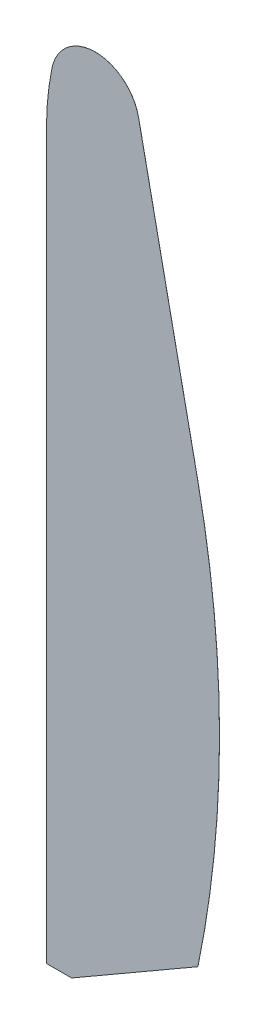
ISO-10303-21;
HEADER;
FILE_DESCRIPTION(('STEP AP214'),'2;1');
FILE_NAME('part.step','',(''),(''),'','','');
FILE_SCHEMA(('AUTOMOTIVE_DESIGN { 1 0 10303 214 1 1 1 1 }'));
ENDSEC;
DATA;
#1=APPLICATION_CONTEXT('core data for automotive mechanical design processes');
#2=APPLICATION_PROTOCOL_DEFINITION('international standard','automotive_design',2000,#1);
#3=PRODUCT_CONTEXT('',#1,'mechanical');
#4=PRODUCT('Part','Part','',(#3));
#5=PRODUCT_RELATED_PRODUCT_CATEGORY('part','',(#4));
#6=PRODUCT_DEFINITION_FORMATION('','',#4);
#7=PRODUCT_DEFINITION_CONTEXT('part definition',#1,'design');
#8=PRODUCT_DEFINITION('design','',#6,#7);
#9=PRODUCT_DEFINITION_SHAPE('','',#8);
#10=(LENGTH_UNIT() NAMED_UNIT(*) SI_UNIT(.MILLI.,.METRE.));
#11=(NAMED_UNIT(*) PLANE_ANGLE_UNIT() SI_UNIT($,.RADIAN.));
#12=(NAMED_UNIT(*) SI_UNIT($,.STERADIAN.) SOLID_ANGLE_UNIT());
#13=UNCERTAINTY_MEASURE_WITH_UNIT(LENGTH_MEASURE(1.E-05),#10,'distance_accuracy_value','');
#14=(GEOMETRIC_REPRESENTATION_CONTEXT(3) GLOBAL_UNCERTAINTY_ASSIGNED_CONTEXT((#13)) GLOBAL_UNIT_ASSIGNED_CONTEXT((#10,
#11,#12)) REPRESENTATION_CONTEXT('',''));
#15=CARTESIAN_POINT('',(0.,0.,0.));
#16=DIRECTION('',(0.,0.,1.));
#17=DIRECTION('',(1.,0.,0.));
#18=AXIS2_PLACEMENT_3D('',#15,#16,#17);
#19=CARTESIAN_POINT('',(9.72703932899535,153.209747665871,0.01));
#20=DIRECTION('',(0.,0.,-1.));
#21=DIRECTION('',(-1.,0.,0.));
#22=AXIS2_PLACEMENT_3D('',#19,#20,#21);
#23=CYLINDRICAL_SURFACE('',#22,8.79523950712746);
#24=CARTESIAN_POINT('',(9.72703932899535,153.209747665871,0.));
#25=DIRECTION('',(0.,0.,-1.));
#26=DIRECTION('',(-1.,0.,0.));
#27=AXIS2_PLACEMENT_3D('',#24,#25,#26);
#28=CIRCLE('',#27,8.79523950712746);
#29=CARTESIAN_POINT('',(1.11592821788536,155.,0.));
#30=VERTEX_POINT('',#29);
#31=CARTESIAN_POINT('',(18.3381504401054,155.,0.));
#32=VERTEX_POINT('',#31);
#33=EDGE_CURVE('E129',#30,#32,#28,.T.);
#34=ORIENTED_EDGE('',*,*,#33,.F.);
#35=DIRECTION('',(0.,0.,-1.));
#36=VECTOR('',#35,1.);
#37=CARTESIAN_POINT('',(1.11592821788536,155.,0.01));
#38=LINE('',#37,#36);
#39=CARTESIAN_POINT('',(1.11592821788536,155.,0.01));
#40=VERTEX_POINT('',#39);
#41=EDGE_CURVE('E11',#40,#30,#38,.T.);
#42=ORIENTED_EDGE('',*,*,#41,.F.);
#43=CARTESIAN_POINT('',(9.72703932899535,153.209747665871,0.01));
#44=DIRECTION('',(0.,0.,-1.));
#45=DIRECTION('',(-1.,0.,0.));
#46=AXIS2_PLACEMENT_3D('',#43,#44,#45);
#47=CIRCLE('',#46,8.79523950712746);
#48=CARTESIAN_POINT('',(18.3381504401054,155.,0.01));
#49=VERTEX_POINT('',#48);
#50=EDGE_CURVE('E144',#40,#49,#47,.T.);
#51=ORIENTED_EDGE('',*,*,#50,.T.);
#52=DIRECTION('',(0.,0.,-1.));
#53=VECTOR('',#52,1.);
#54=CARTESIAN_POINT('',(18.3381504401054,155.,0.01));
#55=LINE('',#54,#53);
#56=EDGE_CURVE('E42',#49,#32,#55,.T.);
#57=ORIENTED_EDGE('',*,*,#56,.T.);
#58=EDGE_LOOP('',(#34,#42,#51,#57));
#59=FACE_BOUND('',#58,.T.);
#60=ADVANCED_FACE('F41',(#59),#23,.T.);
#61=CARTESIAN_POINT('',(53.3044123630607,144.15,0.01));
#62=DIRECTION('',(0.,0.,-1.));
#63=DIRECTION('',(-1.,0.,0.));
#64=AXIS2_PLACEMENT_3D('',#61,#62,#63);
#65=CYLINDRICAL_SURFACE('',#64,53.3044123630607);
#66=CARTESIAN_POINT('',(53.3044123630607,144.15,0.));
#67=DIRECTION('',(0.,0.,-1.));
#68=DIRECTION('',(-1.,0.,0.));
#69=AXIS2_PLACEMENT_3D('',#66,#67,#68);
#70=CIRCLE('',#69,53.3044123630607);
#71=CARTESIAN_POINT('',(0.,144.15,0.));
#72=VERTEX_POINT('',#71);
#73=EDGE_CURVE('E141',#72,#30,#70,.T.);
#74=ORIENTED_EDGE('',*,*,#73,.F.);
#75=DIRECTION('',(0.,0.,-1.));
#76=VECTOR('',#75,1.);
#77=CARTESIAN_POINT('',(0.,144.15,0.01));
#78=LINE('',#77,#76);
#79=CARTESIAN_POINT('',(0.,144.15,0.01));
#80=VERTEX_POINT('',#79);
#81=EDGE_CURVE('E49',#80,#72,#78,.T.);
#82=ORIENTED_EDGE('',*,*,#81,.F.);
#83=CARTESIAN_POINT('',(53.3044123630607,144.15,0.01));
#84=DIRECTION('',(0.,0.,-1.));
#85=DIRECTION('',(-1.,0.,0.));
#86=AXIS2_PLACEMENT_3D('',#83,#84,#85);
#87=CIRCLE('',#86,53.3044123630607);
#88=EDGE_CURVE('E122',#80,#40,#87,.T.);
#89=ORIENTED_EDGE('',*,*,#88,.T.);
#90=ORIENTED_EDGE('',*,*,#41,.T.);
#91=EDGE_LOOP('',(#74,#82,#89,#90));
#92=FACE_BOUND('',#91,.T.);
#93=ADVANCED_FACE('F160',(#92),#65,.T.);
#94=CARTESIAN_POINT('',(0.,0.,0.01));
#95=DIRECTION('',(-1.,0.,0.));
#96=DIRECTION('',(0.,0.,1.));
#97=AXIS2_PLACEMENT_3D('',#94,#95,#96);
#98=PLANE('',#97);
#99=DIRECTION('',(0.,1.,0.));
#100=VECTOR('',#99,1.);
#101=CARTESIAN_POINT('',(0.,0.,0.));
#102=LINE('',#101,#100);
#103=CARTESIAN_POINT('',(0.,0.,0.));
#104=VERTEX_POINT('',#103);
#105=EDGE_CURVE('E109',#104,#72,#102,.T.);
#106=ORIENTED_EDGE('',*,*,#105,.F.);
#107=DIRECTION('',(0.,0.,-1.));
#108=VECTOR('',#107,1.);
#109=CARTESIAN_POINT('',(0.,0.,0.01));
#110=LINE('',#109,#108);
#111=CARTESIAN_POINT('',(0.,0.,0.01));
#112=VERTEX_POINT('',#111);
#113=EDGE_CURVE('E102',#112,#104,#110,.T.);
#114=ORIENTED_EDGE('',*,*,#113,.F.);
#115=DIRECTION('',(0.,1.,0.));
#116=VECTOR('',#115,1.);
#117=CARTESIAN_POINT('',(0.,0.,0.01));
#118=LINE('',#117,#116);
#119=EDGE_CURVE('E107',#112,#80,#118,.T.);
#120=ORIENTED_EDGE('',*,*,#119,.T.);
#121=ORIENTED_EDGE('',*,*,#81,.T.);
#122=EDGE_LOOP('',(#106,#114,#120,#121));
#123=FACE_BOUND('',#122,.T.);
#124=ADVANCED_FACE('F106',(#123),#98,.T.);
#125=CARTESIAN_POINT('',(0.,0.,0.01));
#126=DIRECTION('',(0.,1.,0.));
#127=DIRECTION('',(-1.,0.,0.));
#128=AXIS2_PLACEMENT_3D('',#125,#126,#127);
#129=PLANE('',#128);
#130=DIRECTION('',(1.,0.,0.));
#131=VECTOR('',#130,1.);
#132=CARTESIAN_POINT('',(0.,0.,0.));
#133=LINE('',#132,#131);
#134=CARTESIAN_POINT('',(5.,0.,0.));
#135=VERTEX_POINT('',#134);
#136=EDGE_CURVE('E139',#104,#135,#133,.T.);
#137=ORIENTED_EDGE('',*,*,#136,.T.);
#138=DIRECTION('',(0.,0.,-1.));
#139=VECTOR('',#138,1.);
#140=CARTESIAN_POINT('',(5.,0.,0.01));
#141=LINE('',#140,#139);
#142=CARTESIAN_POINT('',(5.,0.,0.01));
#143=VERTEX_POINT('',#142);
#144=EDGE_CURVE('E114',#143,#135,#141,.T.);
#145=ORIENTED_EDGE('',*,*,#144,.F.);
#146=DIRECTION('',(1.,0.,0.));
#147=VECTOR('',#146,1.);
#148=CARTESIAN_POINT('',(0.,0.,0.01));
#149=LINE('',#148,#147);
#150=EDGE_CURVE('E119',#112,#143,#149,.T.);
#151=ORIENTED_EDGE('',*,*,#150,.F.);
#152=ORIENTED_EDGE('',*,*,#113,.T.);
#153=EDGE_LOOP('',(#137,#145,#151,#152));
#154=FACE_BOUND('',#153,.T.);
#155=ADVANCED_FACE('F116',(#154),#129,.F.);
#156=CARTESIAN_POINT('',(5.,0.,0.01));
#157=DIRECTION('',(-0.500000000000001,0.866025403784438,0.));
#158=DIRECTION('',(-0.866025403784438,-0.500000000000001,0.));
#159=AXIS2_PLACEMENT_3D('',#156,#157,#158);
#160=PLANE('',#159);
#161=DIRECTION('',(0.866025403784438,0.500000000000001,0.));
#162=VECTOR('',#161,1.);
#163=CARTESIAN_POINT('',(5.,0.,0.));
#164=LINE('',#163,#162);
#165=CARTESIAN_POINT('',(30.138888888885,14.5139442671258,0.));
#166=VERTEX_POINT('',#165);
#167=EDGE_CURVE('E136',#135,#166,#164,.T.);
#168=ORIENTED_EDGE('',*,*,#167,.T.);
#169=DIRECTION('',(0.,0.,-1.));
#170=VECTOR('',#169,1.);
#171=CARTESIAN_POINT('',(30.138888888885,14.5139442671258,0.01));
#172=LINE('',#171,#170);
#173=CARTESIAN_POINT('',(30.138888888885,14.5139442671258,0.01));
#174=VERTEX_POINT('',#173);
#175=EDGE_CURVE('E149',#174,#166,#172,.T.);
#176=ORIENTED_EDGE('',*,*,#175,.F.);
#177=DIRECTION('',(0.866025403784438,0.500000000000001,0.));
#178=VECTOR('',#177,1.);
#179=CARTESIAN_POINT('',(5.,0.,0.01));
#180=LINE('',#179,#178);
#181=EDGE_CURVE('E123',#143,#174,#180,.T.);
#182=ORIENTED_EDGE('',*,*,#181,.F.);
#183=ORIENTED_EDGE('',*,*,#144,.T.);
#184=EDGE_LOOP('',(#168,#176,#182,#183));
#185=FACE_BOUND('',#184,.T.);
#186=ADVANCED_FACE('F168',(#185),#160,.F.);
#187=CARTESIAN_POINT('',(-171.218523036127,56.3762047863051,0.01));
#188=DIRECTION('',(0.,0.,-1.));
#189=DIRECTION('',(-1.,0.,0.));
#190=AXIS2_PLACEMENT_3D('',#187,#188,#189);
#191=CYLINDRICAL_SURFACE('',#190,205.662967480571);
#192=CARTESIAN_POINT('',(-171.218523036127,56.3762047863051,0.));
#193=DIRECTION('',(0.,0.,1.));
#194=DIRECTION('',(1.,0.,0.));
#195=AXIS2_PLACEMENT_3D('',#192,#193,#194);
#196=CIRCLE('',#195,205.662967480571);
#197=CARTESIAN_POINT('',(30.138888888885,98.2384653054842,0.));
#198=VERTEX_POINT('',#197);
#199=EDGE_CURVE('E132',#166,#198,#196,.T.);
#200=ORIENTED_EDGE('',*,*,#199,.T.);
#201=DIRECTION('',(0.,0.,-1.));
#202=VECTOR('',#201,1.);
#203=CARTESIAN_POINT('',(30.138888888885,98.2384653054842,0.01));
#204=LINE('',#203,#202);
#205=CARTESIAN_POINT('',(30.138888888885,98.2384653054842,0.01));
#206=VERTEX_POINT('',#205);
#207=EDGE_CURVE('E151',#206,#198,#204,.T.);
#208=ORIENTED_EDGE('',*,*,#207,.F.);
#209=CARTESIAN_POINT('',(-171.218523036127,56.3762047863051,0.01));
#210=DIRECTION('',(0.,0.,1.));
#211=DIRECTION('',(1.,0.,0.));
#212=AXIS2_PLACEMENT_3D('',#209,#210,#211);
#213=CIRCLE('',#212,205.662967480571);
#214=EDGE_CURVE('E234',#174,#206,#213,.T.);
#215=ORIENTED_EDGE('',*,*,#214,.F.);
#216=ORIENTED_EDGE('',*,*,#175,.T.);
#217=EDGE_LOOP('',(#200,#208,#215,#216));
#218=FACE_BOUND('',#217,.T.);
#219=ADVANCED_FACE('F175',(#218),#191,.T.);
#220=CARTESIAN_POINT('',(18.3381504401054,155.,0.01));
#221=DIRECTION('',(0.979064993526527,0.203547877539664,0.));
#222=DIRECTION('',(-0.203547877539664,0.979064993526527,0.));
#223=AXIS2_PLACEMENT_3D('',#220,#221,#222);
#224=PLANE('',#223);
#225=DIRECTION('',(0.203547877539664,-0.979064993526527,0.));
#226=VECTOR('',#225,1.);
#227=CARTESIAN_POINT('',(18.3381504401054,155.,0.));
#228=LINE('',#227,#226);
#229=EDGE_CURVE('E131',#32,#198,#228,.T.);
#230=ORIENTED_EDGE('',*,*,#229,.F.);
#231=ORIENTED_EDGE('',*,*,#56,.F.);
#232=DIRECTION('',(0.203547877539664,-0.979064993526527,0.));
#233=VECTOR('',#232,1.);
#234=CARTESIAN_POINT('',(18.3381504401054,155.,0.01));
#235=LINE('',#234,#233);
#236=EDGE_CURVE('E237',#49,#206,#235,.T.);
#237=ORIENTED_EDGE('',*,*,#236,.T.);
#238=ORIENTED_EDGE('',*,*,#207,.T.);
#239=EDGE_LOOP('',(#230,#231,#237,#238));
#240=FACE_BOUND('',#239,.T.);
#241=ADVANCED_FACE('F153',(#240),#224,.T.);
#242=CARTESIAN_POINT('',(9.72703932899535,153.209747665871,0.01));
#243=DIRECTION('',(0.,0.,-1.));
#244=DIRECTION('',(-1.,0.,0.));
#245=AXIS2_PLACEMENT_3D('',#242,#243,#244);
#246=PLANE('',#245);
#247=ORIENTED_EDGE('',*,*,#50,.F.);
#248=ORIENTED_EDGE('',*,*,#88,.F.);
#249=ORIENTED_EDGE('',*,*,#119,.F.);
#250=ORIENTED_EDGE('',*,*,#150,.T.);
#251=ORIENTED_EDGE('',*,*,#181,.T.);
#252=ORIENTED_EDGE('',*,*,#214,.T.);
#253=ORIENTED_EDGE('',*,*,#236,.F.);
#254=EDGE_LOOP('',(#247,#248,#249,#250,#251,#252,#253));
#255=FACE_BOUND('',#254,.T.);
#256=ADVANCED_FACE('F121',(#255),#246,.F.);
#257=CARTESIAN_POINT('',(9.72703932899535,153.209747665871,0.));
#258=DIRECTION('',(0.,0.,-1.));
#259=DIRECTION('',(-1.,0.,0.));
#260=AXIS2_PLACEMENT_3D('',#257,#258,#259);
#261=PLANE('',#260);
#262=ORIENTED_EDGE('',*,*,#33,.T.);
#263=ORIENTED_EDGE('',*,*,#229,.T.);
#264=ORIENTED_EDGE('',*,*,#199,.F.);
#265=ORIENTED_EDGE('',*,*,#167,.F.);
#266=ORIENTED_EDGE('',*,*,#136,.F.);
#267=ORIENTED_EDGE('',*,*,#105,.T.);
#268=ORIENTED_EDGE('',*,*,#73,.T.);
#269=EDGE_LOOP('',(#262,#263,#264,#265,#266,#267,#268));
#270=FACE_BOUND('',#269,.T.);
#271=ADVANCED_FACE('F156',(#270),#261,.T.);
#272=CLOSED_SHELL('',(#60,#93,#124,#155,#186,#219,#241,#256,#271));
#273=MANIFOLD_SOLID_BREP('B2',#272);
#274=ADVANCED_BREP_SHAPE_REPRESENTATION('',(#18,#273),#14);
#275=SHAPE_DEFINITION_REPRESENTATION(#9,#274);
ENDSEC;
END-ISO-10303-21;
